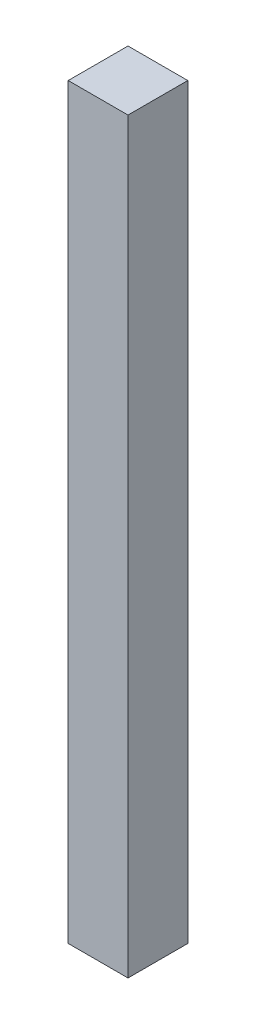
ISO-10303-21;
HEADER;
FILE_DESCRIPTION(('STEP AP214'),'2;1');
FILE_NAME('part.step','',(''),(''),'','','');
FILE_SCHEMA(('AUTOMOTIVE_DESIGN { 1 0 10303 214 1 1 1 1 }'));
ENDSEC;
DATA;
#1=APPLICATION_CONTEXT('core data for automotive mechanical design processes');
#2=APPLICATION_PROTOCOL_DEFINITION('international standard','automotive_design',2000,#1);
#3=PRODUCT_CONTEXT('',#1,'mechanical');
#4=PRODUCT('Part','Part','',(#3));
#5=PRODUCT_RELATED_PRODUCT_CATEGORY('part','',(#4));
#6=PRODUCT_DEFINITION_FORMATION('','',#4);
#7=PRODUCT_DEFINITION_CONTEXT('part definition',#1,'design');
#8=PRODUCT_DEFINITION('design','',#6,#7);
#9=PRODUCT_DEFINITION_SHAPE('','',#8);
#10=(LENGTH_UNIT() NAMED_UNIT(*) SI_UNIT(.MILLI.,.METRE.));
#11=(NAMED_UNIT(*) PLANE_ANGLE_UNIT() SI_UNIT($,.RADIAN.));
#12=(NAMED_UNIT(*) SI_UNIT($,.STERADIAN.) SOLID_ANGLE_UNIT());
#13=UNCERTAINTY_MEASURE_WITH_UNIT(LENGTH_MEASURE(1.E-05),#10,'distance_accuracy_value','');
#14=(GEOMETRIC_REPRESENTATION_CONTEXT(3) GLOBAL_UNCERTAINTY_ASSIGNED_CONTEXT((#13)) GLOBAL_UNIT_ASSIGNED_CONTEXT((#10,
#11,#12)) REPRESENTATION_CONTEXT('',''));
#15=CARTESIAN_POINT('',(0.,0.,0.));
#16=DIRECTION('',(0.,0.,1.));
#17=DIRECTION('',(1.,0.,0.));
#18=AXIS2_PLACEMENT_3D('',#15,#16,#17);
#19=CARTESIAN_POINT('',(10.,250.,10.));
#20=DIRECTION('',(-1.,0.,0.));
#21=DIRECTION('',(0.,0.,1.));
#22=AXIS2_PLACEMENT_3D('',#19,#20,#21);
#23=PLANE('',#22);
#24=DIRECTION('',(0.,0.,-1.));
#25=VECTOR('',#24,1.);
#26=CARTESIAN_POINT('',(10.,0.,10.));
#27=LINE('',#26,#25);
#28=CARTESIAN_POINT('',(10.,0.,10.));
#29=VERTEX_POINT('',#28);
#30=CARTESIAN_POINT('',(10.,0.,-10.));
#31=VERTEX_POINT('',#30);
#32=EDGE_CURVE('E96',#29,#31,#27,.T.);
#33=ORIENTED_EDGE('',*,*,#32,.T.);
#34=DIRECTION('',(0.,-1.,0.));
#35=VECTOR('',#34,1.);
#36=CARTESIAN_POINT('',(10.,250.,-10.));
#37=LINE('',#36,#35);
#38=CARTESIAN_POINT('',(10.,250.,-10.));
#39=VERTEX_POINT('',#38);
#40=EDGE_CURVE('E11',#39,#31,#37,.T.);
#41=ORIENTED_EDGE('',*,*,#40,.F.);
#42=DIRECTION('',(0.,0.,-1.));
#43=VECTOR('',#42,1.);
#44=CARTESIAN_POINT('',(10.,250.,10.));
#45=LINE('',#44,#43);
#46=CARTESIAN_POINT('',(10.,250.,10.));
#47=VERTEX_POINT('',#46);
#48=EDGE_CURVE('E84',#47,#39,#45,.T.);
#49=ORIENTED_EDGE('',*,*,#48,.F.);
#50=DIRECTION('',(0.,-1.,0.));
#51=VECTOR('',#50,1.);
#52=CARTESIAN_POINT('',(10.,250.,10.));
#53=LINE('',#52,#51);
#54=EDGE_CURVE('E92',#47,#29,#53,.T.);
#55=ORIENTED_EDGE('',*,*,#54,.T.);
#56=EDGE_LOOP('',(#33,#41,#49,#55));
#57=FACE_BOUND('',#56,.T.);
#58=ADVANCED_FACE('F33',(#57),#23,.F.);
#59=CARTESIAN_POINT('',(-10.,250.,-10.));
#60=DIRECTION('',(0.,0.,1.));
#61=DIRECTION('',(1.,0.,0.));
#62=AXIS2_PLACEMENT_3D('',#59,#60,#61);
#63=PLANE('',#62);
#64=DIRECTION('',(-1.,0.,0.));
#65=VECTOR('',#64,1.);
#66=CARTESIAN_POINT('',(-10.,0.,-10.));
#67=LINE('',#66,#65);
#68=CARTESIAN_POINT('',(-10.,0.,-10.));
#69=VERTEX_POINT('',#68);
#70=EDGE_CURVE('E88',#31,#69,#67,.T.);
#71=ORIENTED_EDGE('',*,*,#70,.T.);
#72=DIRECTION('',(0.,-1.,0.));
#73=VECTOR('',#72,1.);
#74=CARTESIAN_POINT('',(-10.,250.,-10.));
#75=LINE('',#74,#73);
#76=CARTESIAN_POINT('',(-10.,250.,-10.));
#77=VERTEX_POINT('',#76);
#78=EDGE_CURVE('E41',#77,#69,#75,.T.);
#79=ORIENTED_EDGE('',*,*,#78,.F.);
#80=DIRECTION('',(-1.,0.,0.));
#81=VECTOR('',#80,1.);
#82=CARTESIAN_POINT('',(-10.,250.,-10.));
#83=LINE('',#82,#81);
#84=EDGE_CURVE('E79',#39,#77,#83,.T.);
#85=ORIENTED_EDGE('',*,*,#84,.F.);
#86=ORIENTED_EDGE('',*,*,#40,.T.);
#87=EDGE_LOOP('',(#71,#79,#85,#86));
#88=FACE_BOUND('',#87,.T.);
#89=ADVANCED_FACE('F87',(#88),#63,.F.);
#90=CARTESIAN_POINT('',(-10.,250.,10.));
#91=DIRECTION('',(1.,0.,0.));
#92=DIRECTION('',(0.,0.,-1.));
#93=AXIS2_PLACEMENT_3D('',#90,#91,#92);
#94=PLANE('',#93);
#95=DIRECTION('',(0.,0.,1.));
#96=VECTOR('',#95,1.);
#97=CARTESIAN_POINT('',(-10.,0.,10.));
#98=LINE('',#97,#96);
#99=CARTESIAN_POINT('',(-10.,0.,10.));
#100=VERTEX_POINT('',#99);
#101=EDGE_CURVE('E66',#69,#100,#98,.T.);
#102=ORIENTED_EDGE('',*,*,#101,.T.);
#103=DIRECTION('',(0.,-1.,0.));
#104=VECTOR('',#103,1.);
#105=CARTESIAN_POINT('',(-10.,250.,10.));
#106=LINE('',#105,#104);
#107=CARTESIAN_POINT('',(-10.,250.,10.));
#108=VERTEX_POINT('',#107);
#109=EDGE_CURVE('E89',#108,#100,#106,.T.);
#110=ORIENTED_EDGE('',*,*,#109,.F.);
#111=DIRECTION('',(0.,0.,1.));
#112=VECTOR('',#111,1.);
#113=CARTESIAN_POINT('',(-10.,250.,10.));
#114=LINE('',#113,#112);
#115=EDGE_CURVE('E82',#77,#108,#114,.T.);
#116=ORIENTED_EDGE('',*,*,#115,.F.);
#117=ORIENTED_EDGE('',*,*,#78,.T.);
#118=EDGE_LOOP('',(#102,#110,#116,#117));
#119=FACE_BOUND('',#118,.T.);
#120=ADVANCED_FACE('F90',(#119),#94,.F.);
#121=CARTESIAN_POINT('',(-10.,250.,10.));
#122=DIRECTION('',(0.,0.,-1.));
#123=DIRECTION('',(-1.,0.,0.));
#124=AXIS2_PLACEMENT_3D('',#121,#122,#123);
#125=PLANE('',#124);
#126=DIRECTION('',(1.,0.,0.));
#127=VECTOR('',#126,1.);
#128=CARTESIAN_POINT('',(-10.,0.,10.));
#129=LINE('',#128,#127);
#130=EDGE_CURVE('E72',#100,#29,#129,.T.);
#131=ORIENTED_EDGE('',*,*,#130,.T.);
#132=ORIENTED_EDGE('',*,*,#54,.F.);
#133=DIRECTION('',(1.,0.,0.));
#134=VECTOR('',#133,1.);
#135=CARTESIAN_POINT('',(-10.,250.,10.));
#136=LINE('',#135,#134);
#137=EDGE_CURVE('E49',#108,#47,#136,.T.);
#138=ORIENTED_EDGE('',*,*,#137,.F.);
#139=ORIENTED_EDGE('',*,*,#109,.T.);
#140=EDGE_LOOP('',(#131,#132,#138,#139));
#141=FACE_BOUND('',#140,.T.);
#142=ADVANCED_FACE('F103',(#141),#125,.F.);
#143=CARTESIAN_POINT('',(0.,250.,0.));
#144=DIRECTION('',(0.,-1.,0.));
#145=DIRECTION('',(0.,0.,-1.));
#146=AXIS2_PLACEMENT_3D('',#143,#144,#145);
#147=PLANE('',#146);
#148=ORIENTED_EDGE('',*,*,#48,.T.);
#149=ORIENTED_EDGE('',*,*,#84,.T.);
#150=ORIENTED_EDGE('',*,*,#115,.T.);
#151=ORIENTED_EDGE('',*,*,#137,.T.);
#152=EDGE_LOOP('',(#148,#149,#150,#151));
#153=FACE_BOUND('',#152,.T.);
#154=ADVANCED_FACE('F80',(#153),#147,.F.);
#155=CARTESIAN_POINT('',(0.,0.,0.));
#156=DIRECTION('',(0.,-1.,0.));
#157=DIRECTION('',(0.,0.,-1.));
#158=AXIS2_PLACEMENT_3D('',#155,#156,#157);
#159=PLANE('',#158);
#160=ORIENTED_EDGE('',*,*,#32,.F.);
#161=ORIENTED_EDGE('',*,*,#130,.F.);
#162=ORIENTED_EDGE('',*,*,#101,.F.);
#163=ORIENTED_EDGE('',*,*,#70,.F.);
#164=EDGE_LOOP('',(#160,#161,#162,#163));
#165=FACE_BOUND('',#164,.T.);
#166=ADVANCED_FACE('F106',(#165),#159,.T.);
#167=CLOSED_SHELL('',(#58,#89,#120,#142,#154,#166));
#168=MANIFOLD_SOLID_BREP('B2',#167);
#169=ADVANCED_BREP_SHAPE_REPRESENTATION('',(#18,#168),#14);
#170=SHAPE_DEFINITION_REPRESENTATION(#9,#169);
ENDSEC;
END-ISO-10303-21;
